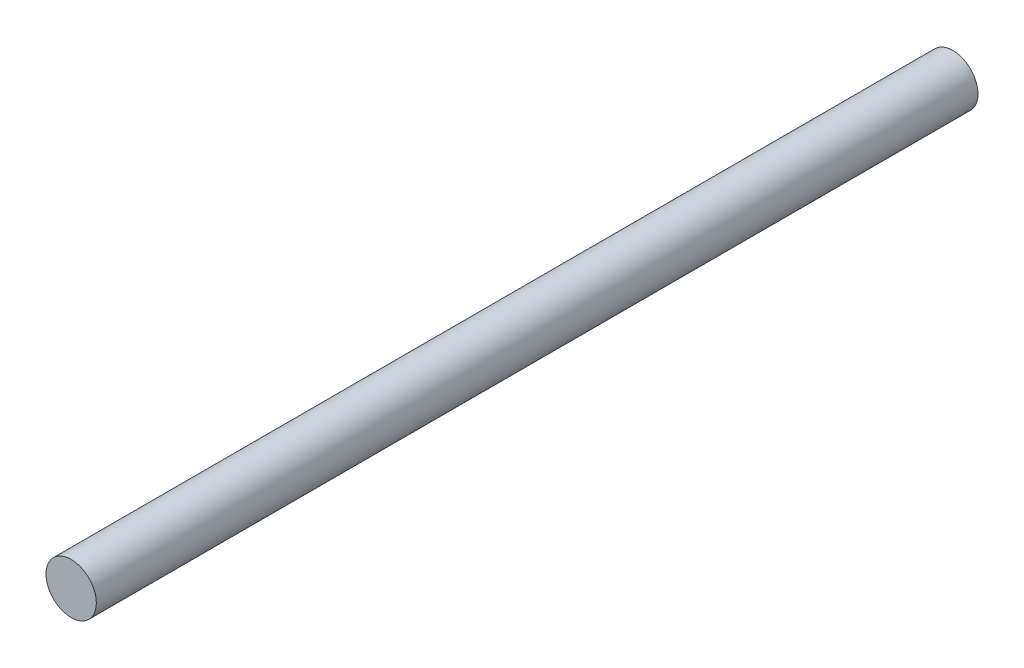
ISO-10303-21;
HEADER;
FILE_DESCRIPTION(('STEP AP214'),'2;1');
FILE_NAME('part.step','',(''),(''),'','','');
FILE_SCHEMA(('AUTOMOTIVE_DESIGN { 1 0 10303 214 1 1 1 1 }'));
ENDSEC;
DATA;
#1=APPLICATION_CONTEXT('core data for automotive mechanical design processes');
#2=APPLICATION_PROTOCOL_DEFINITION('international standard','automotive_design',2000,#1);
#3=PRODUCT_CONTEXT('',#1,'mechanical');
#4=PRODUCT('Part','Part','',(#3));
#5=PRODUCT_RELATED_PRODUCT_CATEGORY('part','',(#4));
#6=PRODUCT_DEFINITION_FORMATION('','',#4);
#7=PRODUCT_DEFINITION_CONTEXT('part definition',#1,'design');
#8=PRODUCT_DEFINITION('design','',#6,#7);
#9=PRODUCT_DEFINITION_SHAPE('','',#8);
#10=(LENGTH_UNIT() NAMED_UNIT(*) SI_UNIT(.MILLI.,.METRE.));
#11=(NAMED_UNIT(*) PLANE_ANGLE_UNIT() SI_UNIT($,.RADIAN.));
#12=(NAMED_UNIT(*) SI_UNIT($,.STERADIAN.) SOLID_ANGLE_UNIT());
#13=UNCERTAINTY_MEASURE_WITH_UNIT(LENGTH_MEASURE(1.E-05),#10,'distance_accuracy_value','');
#14=(GEOMETRIC_REPRESENTATION_CONTEXT(3) GLOBAL_UNCERTAINTY_ASSIGNED_CONTEXT((#13)) GLOBAL_UNIT_ASSIGNED_CONTEXT((#10,
#11,#12)) REPRESENTATION_CONTEXT('',''));
#15=CARTESIAN_POINT('',(0.,0.,0.));
#16=DIRECTION('',(0.,0.,1.));
#17=DIRECTION('',(1.,0.,0.));
#18=AXIS2_PLACEMENT_3D('',#15,#16,#17);
#19=CARTESIAN_POINT('',(500.,420.,-560.));
#20=DIRECTION('',(0.,0.,1.));
#21=DIRECTION('',(1.,0.,0.));
#22=AXIS2_PLACEMENT_3D('',#19,#20,#21);
#23=CYLINDRICAL_SURFACE('',#22,4.);
#24=CARTESIAN_POINT('',(500.,420.,-560.));
#25=DIRECTION('',(0.,0.,1.));
#26=DIRECTION('',(1.,0.,0.));
#27=AXIS2_PLACEMENT_3D('',#24,#25,#26);
#28=CIRCLE('',#27,4.);
#29=CARTESIAN_POINT('',(504.,420.,-560.));
#30=VERTEX_POINT('',#29);
#31=EDGE_CURVE('E10',#30,#30,#28,.T.);
#32=ORIENTED_EDGE('',*,*,#31,.T.);
#33=EDGE_LOOP('',(#32));
#34=FACE_BOUND('',#33,.T.);
#35=CARTESIAN_POINT('',(500.,420.,-420.));
#36=DIRECTION('',(0.,0.,1.));
#37=DIRECTION('',(1.,0.,0.));
#38=AXIS2_PLACEMENT_3D('',#35,#36,#37);
#39=CIRCLE('',#38,4.);
#40=CARTESIAN_POINT('',(504.,420.,-420.));
#41=VERTEX_POINT('',#40);
#42=EDGE_CURVE('E40',#41,#41,#39,.T.);
#43=ORIENTED_EDGE('',*,*,#42,.F.);
#44=EDGE_LOOP('',(#43));
#45=FACE_BOUND('',#44,.T.);
#46=ADVANCED_FACE('F37',(#34,#45),#23,.T.);
#47=CARTESIAN_POINT('',(500.,420.,-560.));
#48=DIRECTION('',(0.,0.,1.));
#49=DIRECTION('',(1.,0.,0.));
#50=AXIS2_PLACEMENT_3D('',#47,#48,#49);
#51=PLANE('',#50);
#52=ORIENTED_EDGE('',*,*,#31,.F.);
#53=EDGE_LOOP('',(#52));
#54=FACE_BOUND('',#53,.T.);
#55=ADVANCED_FACE('F52',(#54),#51,.F.);
#56=CARTESIAN_POINT('',(500.,420.,-420.));
#57=DIRECTION('',(0.,0.,1.));
#58=DIRECTION('',(1.,0.,0.));
#59=AXIS2_PLACEMENT_3D('',#56,#57,#58);
#60=PLANE('',#59);
#61=ORIENTED_EDGE('',*,*,#42,.T.);
#62=EDGE_LOOP('',(#61));
#63=FACE_BOUND('',#62,.T.);
#64=ADVANCED_FACE('F49',(#63),#60,.T.);
#65=CLOSED_SHELL('',(#46,#55,#64));
#66=MANIFOLD_SOLID_BREP('B2',#65);
#67=ADVANCED_BREP_SHAPE_REPRESENTATION('',(#18,#66),#14);
#68=SHAPE_DEFINITION_REPRESENTATION(#9,#67);
ENDSEC;
END-ISO-10303-21;
